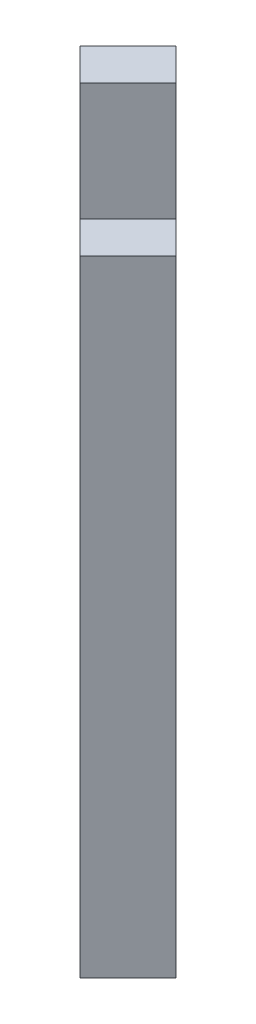
ISO-10303-21;
HEADER;
FILE_DESCRIPTION(('STEP AP214'),'2;1');
FILE_NAME('part.step','',(''),(''),'','','');
FILE_SCHEMA(('AUTOMOTIVE_DESIGN { 1 0 10303 214 1 1 1 1 }'));
ENDSEC;
DATA;
#1=APPLICATION_CONTEXT('core data for automotive mechanical design processes');
#2=APPLICATION_PROTOCOL_DEFINITION('international standard','automotive_design',2000,#1);
#3=PRODUCT_CONTEXT('',#1,'mechanical');
#4=PRODUCT('Part','Part','',(#3));
#5=PRODUCT_RELATED_PRODUCT_CATEGORY('part','',(#4));
#6=PRODUCT_DEFINITION_FORMATION('','',#4);
#7=PRODUCT_DEFINITION_CONTEXT('part definition',#1,'design');
#8=PRODUCT_DEFINITION('design','',#6,#7);
#9=PRODUCT_DEFINITION_SHAPE('','',#8);
#10=(LENGTH_UNIT() NAMED_UNIT(*) SI_UNIT(.MILLI.,.METRE.));
#11=(NAMED_UNIT(*) PLANE_ANGLE_UNIT() SI_UNIT($,.RADIAN.));
#12=(NAMED_UNIT(*) SI_UNIT($,.STERADIAN.) SOLID_ANGLE_UNIT());
#13=UNCERTAINTY_MEASURE_WITH_UNIT(LENGTH_MEASURE(1.E-05),#10,'distance_accuracy_value','');
#14=(GEOMETRIC_REPRESENTATION_CONTEXT(3) GLOBAL_UNCERTAINTY_ASSIGNED_CONTEXT((#13)) GLOBAL_UNIT_ASSIGNED_CONTEXT((#10,
#11,#12)) REPRESENTATION_CONTEXT('',''));
#15=CARTESIAN_POINT('',(0.,0.,0.));
#16=DIRECTION('',(0.,0.,1.));
#17=DIRECTION('',(1.,0.,0.));
#18=AXIS2_PLACEMENT_3D('',#15,#16,#17);
#19=CARTESIAN_POINT('',(0.,275.,0.));
#20=DIRECTION('',(0.,1.,0.));
#21=DIRECTION('',(0.,0.,1.));
#22=AXIS2_PLACEMENT_3D('',#19,#20,#21);
#23=PLANE('',#22);
#24=DIRECTION('',(0.707106781186548,0.,-0.707106781186547));
#25=VECTOR('',#24,1.);
#26=CARTESIAN_POINT('',(469.644660940673,275.,-212.928932188135));
#27=LINE('',#26,#25);
#28=CARTESIAN_POINT('',(469.644660940673,275.,-212.928932188135));
#29=VERTEX_POINT('',#28);
#30=CARTESIAN_POINT('',(490.857864376269,275.,-234.142135623731));
#31=VERTEX_POINT('',#30);
#32=EDGE_CURVE('E153',#29,#31,#27,.T.);
#33=ORIENTED_EDGE('',*,*,#32,.F.);
#34=DIRECTION('',(0.707106781186548,0.,0.707106781186547));
#35=VECTOR('',#34,1.);
#36=CARTESIAN_POINT('',(403.786796564404,275.,-278.786796564404));
#37=LINE('',#36,#35);
#38=CARTESIAN_POINT('',(483.786796564403,275.,-198.786796564404));
#39=VERTEX_POINT('',#38);
#40=EDGE_CURVE('E144',#29,#39,#37,.T.);
#41=ORIENTED_EDGE('',*,*,#40,.T.);
#42=DIRECTION('',(0.707106781186556,0.,-0.707106781186539));
#43=VECTOR('',#42,1.);
#44=CARTESIAN_POINT('',(505.,275.,-220.));
#45=LINE('',#44,#43);
#46=CARTESIAN_POINT('',(505.,275.,-220.));
#47=VERTEX_POINT('',#46);
#48=EDGE_CURVE('E191',#39,#47,#45,.T.);
#49=ORIENTED_EDGE('',*,*,#48,.T.);
#50=DIRECTION('',(-0.707106781186548,0.,-0.707106781186548));
#51=VECTOR('',#50,1.);
#52=CARTESIAN_POINT('',(505.,275.,-220.));
#53=LINE('',#52,#51);
#54=EDGE_CURVE('E182',#47,#31,#53,.T.);
#55=ORIENTED_EDGE('',*,*,#54,.T.);
#56=EDGE_LOOP('',(#33,#41,#49,#55));
#57=FACE_BOUND('',#56,.T.);
#58=ADVANCED_FACE('F32',(#57),#23,.T.);
#59=CARTESIAN_POINT('',(0.,0.,0.));
#60=DIRECTION('',(0.,1.,0.));
#61=DIRECTION('',(0.,0.,1.));
#62=AXIS2_PLACEMENT_3D('',#59,#60,#61);
#63=PLANE('',#62);
#64=DIRECTION('',(0.707106781186548,0.,0.707106781186547));
#65=VECTOR('',#64,1.);
#66=CARTESIAN_POINT('',(403.786796564404,0.,-278.786796564404));
#67=LINE('',#66,#65);
#68=CARTESIAN_POINT('',(469.644660940673,0.,-212.928932188135));
#69=VERTEX_POINT('',#68);
#70=CARTESIAN_POINT('',(483.786796564403,0.,-198.786796564404));
#71=VERTEX_POINT('',#70);
#72=EDGE_CURVE('E199',#69,#71,#67,.T.);
#73=ORIENTED_EDGE('',*,*,#72,.F.);
#74=DIRECTION('',(0.707106781186548,0.,-0.707106781186547));
#75=VECTOR('',#74,1.);
#76=CARTESIAN_POINT('',(469.644660940673,0.,-212.928932188135));
#77=LINE('',#76,#75);
#78=CARTESIAN_POINT('',(490.857864376269,0.,-234.142135623731));
#79=VERTEX_POINT('',#78);
#80=EDGE_CURVE('E151',#69,#79,#77,.T.);
#81=ORIENTED_EDGE('',*,*,#80,.T.);
#82=DIRECTION('',(-0.707106781186548,0.,-0.707106781186548));
#83=VECTOR('',#82,1.);
#84=CARTESIAN_POINT('',(505.,0.,-220.));
#85=LINE('',#84,#83);
#86=CARTESIAN_POINT('',(505.,0.,-220.));
#87=VERTEX_POINT('',#86);
#88=EDGE_CURVE('E194',#87,#79,#85,.T.);
#89=ORIENTED_EDGE('',*,*,#88,.F.);
#90=DIRECTION('',(0.707106781186556,0.,-0.707106781186539));
#91=VECTOR('',#90,1.);
#92=CARTESIAN_POINT('',(505.,0.,-220.));
#93=LINE('',#92,#91);
#94=EDGE_CURVE('E203',#71,#87,#93,.T.);
#95=ORIENTED_EDGE('',*,*,#94,.F.);
#96=EDGE_LOOP('',(#73,#81,#89,#95));
#97=FACE_BOUND('',#96,.T.);
#98=ADVANCED_FACE('F233',(#97),#63,.F.);
#99=CARTESIAN_POINT('',(505.,275.,-220.));
#100=DIRECTION('',(-0.707106781186548,0.,0.707106781186548));
#101=DIRECTION('',(0.707106781186548,0.,0.707106781186548));
#102=AXIS2_PLACEMENT_3D('',#99,#100,#101);
#103=PLANE('',#102);
#104=DIRECTION('',(-0.707106781186547,0.,-0.707106781186548));
#105=VECTOR('',#104,1.);
#106=CARTESIAN_POINT('',(439.142135623731,150.,-285.857864376269));
#107=LINE('',#106,#105);
#108=CARTESIAN_POINT('',(490.857864376269,150.,-234.142135623731));
#109=VERTEX_POINT('',#108);
#110=CARTESIAN_POINT('',(439.142135623731,150.,-285.857864376269));
#111=VERTEX_POINT('',#110);
#112=EDGE_CURVE('E146',#109,#111,#107,.T.);
#113=ORIENTED_EDGE('',*,*,#112,.F.);
#114=DIRECTION('',(0.,-1.,0.));
#115=VECTOR('',#114,1.);
#116=CARTESIAN_POINT('',(490.857864376269,275.,-234.142135623731));
#117=LINE('',#116,#115);
#118=EDGE_CURVE('E127',#31,#109,#117,.T.);
#119=ORIENTED_EDGE('',*,*,#118,.F.);
#120=ORIENTED_EDGE('',*,*,#54,.F.);
#121=DIRECTION('',(0.,-1.,0.));
#122=VECTOR('',#121,1.);
#123=CARTESIAN_POINT('',(505.,275.,-220.));
#124=LINE('',#123,#122);
#125=EDGE_CURVE('E193',#47,#87,#124,.T.);
#126=ORIENTED_EDGE('',*,*,#125,.T.);
#127=ORIENTED_EDGE('',*,*,#88,.T.);
#128=DIRECTION('',(0.,-1.,0.));
#129=VECTOR('',#128,1.);
#130=CARTESIAN_POINT('',(490.857864376269,0.,-234.142135623731));
#131=LINE('',#130,#129);
#132=CARTESIAN_POINT('',(490.857864376269,125.,-234.142135623731));
#133=VERTEX_POINT('',#132);
#134=EDGE_CURVE('E161',#133,#79,#131,.T.);
#135=ORIENTED_EDGE('',*,*,#134,.F.);
#136=DIRECTION('',(0.707106781186547,0.,0.707106781186548));
#137=VECTOR('',#136,1.);
#138=CARTESIAN_POINT('',(439.142135623731,125.,-285.857864376269));
#139=LINE('',#138,#137);
#140=CARTESIAN_POINT('',(439.142135623731,125.,-285.857864376269));
#141=VERTEX_POINT('',#140);
#142=EDGE_CURVE('E171',#141,#133,#139,.T.);
#143=ORIENTED_EDGE('',*,*,#142,.F.);
#144=DIRECTION('',(0.,1.,0.));
#145=VECTOR('',#144,1.);
#146=CARTESIAN_POINT('',(439.142135623731,0.,-285.857864376269));
#147=LINE('',#146,#145);
#148=CARTESIAN_POINT('',(439.142135623731,0.,-285.857864376269));
#149=VERTEX_POINT('',#148);
#150=EDGE_CURVE('E168',#149,#141,#147,.T.);
#151=ORIENTED_EDGE('',*,*,#150,.F.);
#152=CARTESIAN_POINT('',(425.,0.,-300.));
#153=VERTEX_POINT('',#152);
#154=EDGE_CURVE('E155',#149,#153,#85,.T.);
#155=ORIENTED_EDGE('',*,*,#154,.T.);
#156=DIRECTION('',(0.,-1.,0.));
#157=VECTOR('',#156,1.);
#158=CARTESIAN_POINT('',(425.,275.,-300.));
#159=LINE('',#158,#157);
#160=CARTESIAN_POINT('',(425.,275.,-300.));
#161=VERTEX_POINT('',#160);
#162=EDGE_CURVE('E11',#161,#153,#159,.T.);
#163=ORIENTED_EDGE('',*,*,#162,.F.);
#164=CARTESIAN_POINT('',(439.142135623731,275.,-285.857864376269));
#165=VERTEX_POINT('',#164);
#166=EDGE_CURVE('E186',#165,#161,#53,.T.);
#167=ORIENTED_EDGE('',*,*,#166,.F.);
#168=DIRECTION('',(0.,1.,0.));
#169=VECTOR('',#168,1.);
#170=CARTESIAN_POINT('',(439.142135623731,275.,-285.857864376269));
#171=LINE('',#170,#169);
#172=EDGE_CURVE('E47',#111,#165,#171,.T.);
#173=ORIENTED_EDGE('',*,*,#172,.F.);
#174=EDGE_LOOP('',(#113,#119,#120,#126,#127,#135,#143,#151,#155,#163,#167,#173));
#175=FACE_BOUND('',#174,.T.);
#176=ADVANCED_FACE('F34',(#175),#103,.F.);
#177=CARTESIAN_POINT('',(425.,275.,-300.));
#178=DIRECTION('',(0.707106781186548,0.,0.707106781186548));
#179=DIRECTION('',(0.707106781186548,0.,-0.707106781186548));
#180=AXIS2_PLACEMENT_3D('',#177,#178,#179);
#181=PLANE('',#180);
#182=DIRECTION('',(-0.707106781186548,0.,0.707106781186548));
#183=VECTOR('',#182,1.);
#184=CARTESIAN_POINT('',(425.,0.,-300.));
#185=LINE('',#184,#183);
#186=CARTESIAN_POINT('',(403.786796564404,0.,-278.786796564404));
#187=VERTEX_POINT('',#186);
#188=EDGE_CURVE('E197',#153,#187,#185,.T.);
#189=ORIENTED_EDGE('',*,*,#188,.T.);
#190=DIRECTION('',(0.,-1.,0.));
#191=VECTOR('',#190,1.);
#192=CARTESIAN_POINT('',(403.786796564404,275.,-278.786796564404));
#193=LINE('',#192,#191);
#194=CARTESIAN_POINT('',(403.786796564404,275.,-278.786796564404));
#195=VERTEX_POINT('',#194);
#196=EDGE_CURVE('E40',#195,#187,#193,.T.);
#197=ORIENTED_EDGE('',*,*,#196,.F.);
#198=DIRECTION('',(-0.707106781186548,0.,0.707106781186548));
#199=VECTOR('',#198,1.);
#200=CARTESIAN_POINT('',(425.,275.,-300.));
#201=LINE('',#200,#199);
#202=EDGE_CURVE('E185',#161,#195,#201,.T.);
#203=ORIENTED_EDGE('',*,*,#202,.F.);
#204=ORIENTED_EDGE('',*,*,#162,.T.);
#205=EDGE_LOOP('',(#189,#197,#203,#204));
#206=FACE_BOUND('',#205,.T.);
#207=ADVANCED_FACE('F258',(#206),#181,.F.);
#208=CARTESIAN_POINT('',(403.786796564404,275.,-278.786796564404));
#209=DIRECTION('',(0.707106781186547,0.,-0.707106781186548));
#210=DIRECTION('',(-0.707106781186548,0.,-0.707106781186547));
#211=AXIS2_PLACEMENT_3D('',#208,#209,#210);
#212=PLANE('',#211);
#213=ORIENTED_EDGE('',*,*,#40,.F.);
#214=DIRECTION('',(0.,-1.,0.));
#215=VECTOR('',#214,1.);
#216=CARTESIAN_POINT('',(469.644660940673,275.,-212.928932188135));
#217=LINE('',#216,#215);
#218=CARTESIAN_POINT('',(469.644660940673,150.,-212.928932188135));
#219=VERTEX_POINT('',#218);
#220=EDGE_CURVE('E124',#29,#219,#217,.T.);
#221=ORIENTED_EDGE('',*,*,#220,.T.);
#222=DIRECTION('',(-0.707106781186547,0.,-0.707106781186548));
#223=VECTOR('',#222,1.);
#224=CARTESIAN_POINT('',(417.928932188135,150.,-264.644660940673));
#225=LINE('',#224,#223);
#226=CARTESIAN_POINT('',(417.928932188135,150.,-264.644660940673));
#227=VERTEX_POINT('',#226);
#228=EDGE_CURVE('E135',#219,#227,#225,.T.);
#229=ORIENTED_EDGE('',*,*,#228,.T.);
#230=DIRECTION('',(0.,1.,0.));
#231=VECTOR('',#230,1.);
#232=CARTESIAN_POINT('',(417.928932188135,275.,-264.644660940673));
#233=LINE('',#232,#231);
#234=CARTESIAN_POINT('',(417.928932188135,275.,-264.644660940673));
#235=VERTEX_POINT('',#234);
#236=EDGE_CURVE('E132',#227,#235,#233,.T.);
#237=ORIENTED_EDGE('',*,*,#236,.T.);
#238=EDGE_CURVE('E188',#195,#235,#37,.T.);
#239=ORIENTED_EDGE('',*,*,#238,.F.);
#240=ORIENTED_EDGE('',*,*,#196,.T.);
#241=CARTESIAN_POINT('',(417.928932188135,0.,-264.644660940673));
#242=VERTEX_POINT('',#241);
#243=EDGE_CURVE('E200',#187,#242,#67,.T.);
#244=ORIENTED_EDGE('',*,*,#243,.T.);
#245=DIRECTION('',(0.,1.,0.));
#246=VECTOR('',#245,1.);
#247=CARTESIAN_POINT('',(417.928932188135,0.,-264.644660940673));
#248=LINE('',#247,#246);
#249=CARTESIAN_POINT('',(417.928932188135,125.,-264.644660940673));
#250=VERTEX_POINT('',#249);
#251=EDGE_CURVE('E55',#242,#250,#248,.T.);
#252=ORIENTED_EDGE('',*,*,#251,.T.);
#253=DIRECTION('',(0.707106781186547,0.,0.707106781186548));
#254=VECTOR('',#253,1.);
#255=CARTESIAN_POINT('',(417.928932188135,125.,-264.644660940673));
#256=LINE('',#255,#254);
#257=CARTESIAN_POINT('',(469.644660940673,125.,-212.928932188135));
#258=VERTEX_POINT('',#257);
#259=EDGE_CURVE('E160',#250,#258,#256,.T.);
#260=ORIENTED_EDGE('',*,*,#259,.T.);
#261=DIRECTION('',(0.,-1.,0.));
#262=VECTOR('',#261,1.);
#263=CARTESIAN_POINT('',(469.644660940673,0.,-212.928932188135));
#264=LINE('',#263,#262);
#265=EDGE_CURVE('E164',#258,#69,#264,.T.);
#266=ORIENTED_EDGE('',*,*,#265,.T.);
#267=ORIENTED_EDGE('',*,*,#72,.T.);
#268=DIRECTION('',(0.,-1.,0.));
#269=VECTOR('',#268,1.);
#270=CARTESIAN_POINT('',(483.786796564403,275.,-198.786796564404));
#271=LINE('',#270,#269);
#272=EDGE_CURVE('E207',#39,#71,#271,.T.);
#273=ORIENTED_EDGE('',*,*,#272,.F.);
#274=EDGE_LOOP('',(#213,#221,#229,#237,#239,#240,#244,#252,#260,#266,#267,#273));
#275=FACE_BOUND('',#274,.T.);
#276=ADVANCED_FACE('F142',(#275),#212,.F.);
#277=CARTESIAN_POINT('',(505.,275.,-220.));
#278=DIRECTION('',(-0.707106781186539,0.,-0.707106781186556));
#279=DIRECTION('',(-0.707106781186556,0.,0.707106781186539));
#280=AXIS2_PLACEMENT_3D('',#277,#278,#279);
#281=PLANE('',#280);
#282=ORIENTED_EDGE('',*,*,#94,.T.);
#283=ORIENTED_EDGE('',*,*,#125,.F.);
#284=ORIENTED_EDGE('',*,*,#48,.F.);
#285=ORIENTED_EDGE('',*,*,#272,.T.);
#286=EDGE_LOOP('',(#282,#283,#284,#285));
#287=FACE_BOUND('',#286,.T.);
#288=ADVANCED_FACE('F237',(#287),#281,.F.);
#289=DIRECTION('',(0.707106781186548,0.,-0.707106781186547));
#290=VECTOR('',#289,1.);
#291=CARTESIAN_POINT('',(417.928932188135,275.,-264.644660940673));
#292=LINE('',#291,#290);
#293=EDGE_CURVE('E156',#235,#165,#292,.T.);
#294=ORIENTED_EDGE('',*,*,#293,.T.);
#295=ORIENTED_EDGE('',*,*,#166,.T.);
#296=ORIENTED_EDGE('',*,*,#202,.T.);
#297=ORIENTED_EDGE('',*,*,#238,.T.);
#298=EDGE_LOOP('',(#294,#295,#296,#297));
#299=FACE_BOUND('',#298,.T.);
#300=ADVANCED_FACE('F243',(#299),#23,.T.);
#301=ORIENTED_EDGE('',*,*,#154,.F.);
#302=DIRECTION('',(0.707106781186548,0.,-0.707106781186547));
#303=VECTOR('',#302,1.);
#304=CARTESIAN_POINT('',(417.928932188135,0.,-264.644660940673));
#305=LINE('',#304,#303);
#306=EDGE_CURVE('E167',#242,#149,#305,.T.);
#307=ORIENTED_EDGE('',*,*,#306,.F.);
#308=ORIENTED_EDGE('',*,*,#243,.F.);
#309=ORIENTED_EDGE('',*,*,#188,.F.);
#310=EDGE_LOOP('',(#301,#307,#308,#309));
#311=FACE_BOUND('',#310,.T.);
#312=ADVANCED_FACE('F218',(#311),#63,.F.);
#313=CARTESIAN_POINT('',(469.644660940673,0.,-212.928932188135));
#314=DIRECTION('',(0.707106781186547,0.,0.707106781186548));
#315=DIRECTION('',(0.707106781186548,0.,-0.707106781186547));
#316=AXIS2_PLACEMENT_3D('',#313,#314,#315);
#317=PLANE('',#316);
#318=ORIENTED_EDGE('',*,*,#134,.T.);
#319=ORIENTED_EDGE('',*,*,#80,.F.);
#320=ORIENTED_EDGE('',*,*,#265,.F.);
#321=DIRECTION('',(0.707106781186548,0.,-0.707106781186547));
#322=VECTOR('',#321,1.);
#323=CARTESIAN_POINT('',(469.644660940673,125.,-212.928932188135));
#324=LINE('',#323,#322);
#325=EDGE_CURVE('E177',#258,#133,#324,.T.);
#326=ORIENTED_EDGE('',*,*,#325,.T.);
#327=EDGE_LOOP('',(#318,#319,#320,#326));
#328=FACE_BOUND('',#327,.T.);
#329=ADVANCED_FACE('F255',(#328),#317,.F.);
#330=CARTESIAN_POINT('',(417.928932188135,125.,-264.644660940673));
#331=DIRECTION('',(0.,1.,0.));
#332=DIRECTION('',(0.,0.,1.));
#333=AXIS2_PLACEMENT_3D('',#330,#331,#332);
#334=PLANE('',#333);
#335=ORIENTED_EDGE('',*,*,#142,.T.);
#336=ORIENTED_EDGE('',*,*,#325,.F.);
#337=ORIENTED_EDGE('',*,*,#259,.F.);
#338=DIRECTION('',(0.707106781186548,0.,-0.707106781186547));
#339=VECTOR('',#338,1.);
#340=CARTESIAN_POINT('',(417.928932188135,125.,-264.644660940673));
#341=LINE('',#340,#339);
#342=EDGE_CURVE('E179',#250,#141,#341,.T.);
#343=ORIENTED_EDGE('',*,*,#342,.T.);
#344=EDGE_LOOP('',(#335,#336,#337,#343));
#345=FACE_BOUND('',#344,.T.);
#346=ADVANCED_FACE('F226',(#345),#334,.F.);
#347=CARTESIAN_POINT('',(417.928932188135,0.,-264.644660940673));
#348=DIRECTION('',(-0.707106781186547,0.,-0.707106781186548));
#349=DIRECTION('',(-0.707106781186548,0.,0.707106781186547));
#350=AXIS2_PLACEMENT_3D('',#347,#348,#349);
#351=PLANE('',#350);
#352=ORIENTED_EDGE('',*,*,#150,.T.);
#353=ORIENTED_EDGE('',*,*,#342,.F.);
#354=ORIENTED_EDGE('',*,*,#251,.F.);
#355=ORIENTED_EDGE('',*,*,#306,.T.);
#356=EDGE_LOOP('',(#352,#353,#354,#355));
#357=FACE_BOUND('',#356,.T.);
#358=ADVANCED_FACE('F220',(#357),#351,.F.);
#359=CARTESIAN_POINT('',(469.644660940673,275.,-212.928932188135));
#360=DIRECTION('',(0.707106781186547,0.,0.707106781186548));
#361=DIRECTION('',(0.707106781186548,0.,-0.707106781186547));
#362=AXIS2_PLACEMENT_3D('',#359,#360,#361);
#363=PLANE('',#362);
#364=ORIENTED_EDGE('',*,*,#118,.T.);
#365=DIRECTION('',(0.707106781186548,0.,-0.707106781186547));
#366=VECTOR('',#365,1.);
#367=CARTESIAN_POINT('',(469.644660940673,150.,-212.928932188135));
#368=LINE('',#367,#366);
#369=EDGE_CURVE('E120',#219,#109,#368,.T.);
#370=ORIENTED_EDGE('',*,*,#369,.F.);
#371=ORIENTED_EDGE('',*,*,#220,.F.);
#372=ORIENTED_EDGE('',*,*,#32,.T.);
#373=EDGE_LOOP('',(#364,#370,#371,#372));
#374=FACE_BOUND('',#373,.T.);
#375=ADVANCED_FACE('F122',(#374),#363,.F.);
#376=CARTESIAN_POINT('',(417.928932188135,275.,-264.644660940673));
#377=DIRECTION('',(-0.707106781186547,0.,-0.707106781186548));
#378=DIRECTION('',(-0.707106781186548,0.,0.707106781186547));
#379=AXIS2_PLACEMENT_3D('',#376,#377,#378);
#380=PLANE('',#379);
#381=ORIENTED_EDGE('',*,*,#172,.T.);
#382=ORIENTED_EDGE('',*,*,#293,.F.);
#383=ORIENTED_EDGE('',*,*,#236,.F.);
#384=DIRECTION('',(0.707106781186548,0.,-0.707106781186547));
#385=VECTOR('',#384,1.);
#386=CARTESIAN_POINT('',(417.928932188135,150.,-264.644660940673));
#387=LINE('',#386,#385);
#388=EDGE_CURVE('E131',#227,#111,#387,.T.);
#389=ORIENTED_EDGE('',*,*,#388,.T.);
#390=EDGE_LOOP('',(#381,#382,#383,#389));
#391=FACE_BOUND('',#390,.T.);
#392=ADVANCED_FACE('F335',(#391),#380,.F.);
#393=CARTESIAN_POINT('',(417.928932188135,150.,-264.644660940673));
#394=DIRECTION('',(0.,-1.,0.));
#395=DIRECTION('',(0.,0.,-1.));
#396=AXIS2_PLACEMENT_3D('',#393,#394,#395);
#397=PLANE('',#396);
#398=ORIENTED_EDGE('',*,*,#112,.T.);
#399=ORIENTED_EDGE('',*,*,#388,.F.);
#400=ORIENTED_EDGE('',*,*,#228,.F.);
#401=ORIENTED_EDGE('',*,*,#369,.T.);
#402=EDGE_LOOP('',(#398,#399,#400,#401));
#403=FACE_BOUND('',#402,.T.);
#404=ADVANCED_FACE('F136',(#403),#397,.F.);
#405=CLOSED_SHELL('',(#58,#98,#176,#207,#276,#288,#300,#312,#329,#346,#358,#375,#392,#404));
#406=MANIFOLD_SOLID_BREP('B2',#405);
#407=ADVANCED_BREP_SHAPE_REPRESENTATION('',(#18,#406),#14);
#408=SHAPE_DEFINITION_REPRESENTATION(#9,#407);
ENDSEC;
END-ISO-10303-21;
